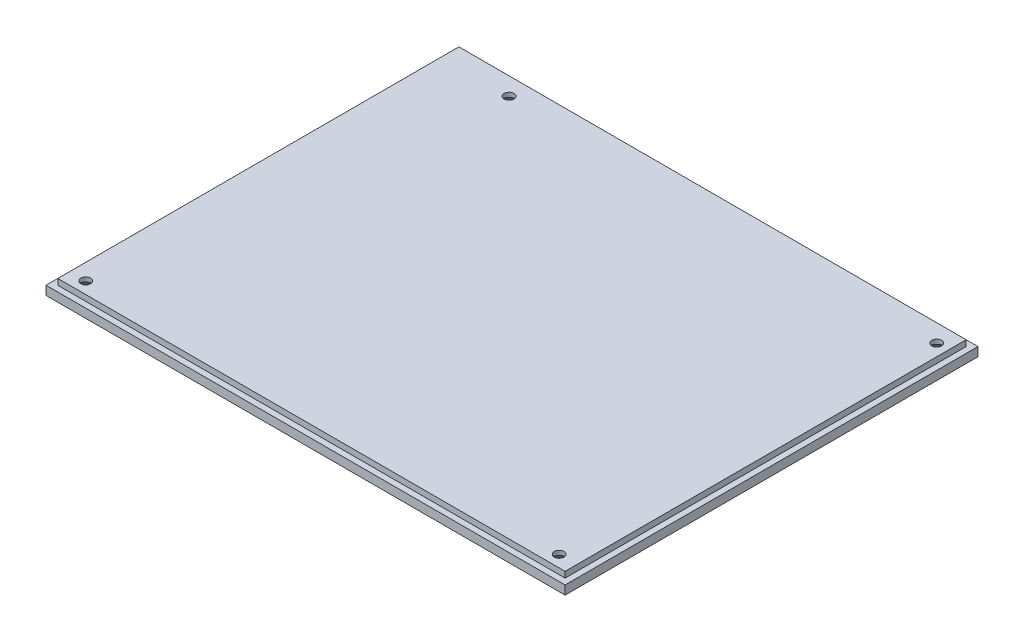
ISO-10303-21;
HEADER;
FILE_DESCRIPTION(('STEP AP214'),'2;1');
FILE_NAME('part.step','',(''),(''),'','','');
FILE_SCHEMA(('AUTOMOTIVE_DESIGN { 1 0 10303 214 1 1 1 1 }'));
ENDSEC;
DATA;
#1=APPLICATION_CONTEXT('core data for automotive mechanical design processes');
#2=APPLICATION_PROTOCOL_DEFINITION('international standard','automotive_design',2000,#1);
#3=PRODUCT_CONTEXT('',#1,'mechanical');
#4=PRODUCT('Part','Part','',(#3));
#5=PRODUCT_RELATED_PRODUCT_CATEGORY('part','',(#4));
#6=PRODUCT_DEFINITION_FORMATION('','',#4);
#7=PRODUCT_DEFINITION_CONTEXT('part definition',#1,'design');
#8=PRODUCT_DEFINITION('design','',#6,#7);
#9=PRODUCT_DEFINITION_SHAPE('','',#8);
#10=(LENGTH_UNIT() NAMED_UNIT(*) SI_UNIT(.MILLI.,.METRE.));
#11=(NAMED_UNIT(*) PLANE_ANGLE_UNIT() SI_UNIT($,.RADIAN.));
#12=(NAMED_UNIT(*) SI_UNIT($,.STERADIAN.) SOLID_ANGLE_UNIT());
#13=UNCERTAINTY_MEASURE_WITH_UNIT(LENGTH_MEASURE(1.E-05),#10,'distance_accuracy_value','');
#14=(GEOMETRIC_REPRESENTATION_CONTEXT(3) GLOBAL_UNCERTAINTY_ASSIGNED_CONTEXT((#13)) GLOBAL_UNIT_ASSIGNED_CONTEXT((#10,
#11,#12)) REPRESENTATION_CONTEXT('',''));
#15=CARTESIAN_POINT('',(0.,0.,0.));
#16=DIRECTION('',(0.,0.,1.));
#17=DIRECTION('',(1.,0.,0.));
#18=AXIS2_PLACEMENT_3D('',#15,#16,#17);
#19=CARTESIAN_POINT('',(0.,1.5,0.));
#20=DIRECTION('',(0.,-1.,0.));
#21=DIRECTION('',(0.,0.,-1.));
#22=AXIS2_PLACEMENT_3D('',#19,#20,#21);
#23=PLANE('',#22);
#24=DIRECTION('',(-1.,0.,0.));
#25=VECTOR('',#24,1.);
#26=CARTESIAN_POINT('',(44.,1.5,35.));
#27=LINE('',#26,#25);
#28=CARTESIAN_POINT('',(44.,1.5,35.));
#29=VERTEX_POINT('',#28);
#30=CARTESIAN_POINT('',(-44.,1.5,35.));
#31=VERTEX_POINT('',#30);
#32=EDGE_CURVE('E143',#29,#31,#27,.T.);
#33=ORIENTED_EDGE('',*,*,#32,.F.);
#34=DIRECTION('',(0.,0.,-1.));
#35=VECTOR('',#34,1.);
#36=CARTESIAN_POINT('',(44.,1.5,35.));
#37=LINE('',#36,#35);
#38=CARTESIAN_POINT('',(44.,1.5,-35.));
#39=VERTEX_POINT('',#38);
#40=EDGE_CURVE('E155',#29,#39,#37,.T.);
#41=ORIENTED_EDGE('',*,*,#40,.T.);
#42=DIRECTION('',(-1.,0.,0.));
#43=VECTOR('',#42,1.);
#44=CARTESIAN_POINT('',(44.,1.5,-35.));
#45=LINE('',#44,#43);
#46=CARTESIAN_POINT('',(-44.,1.5,-35.));
#47=VERTEX_POINT('',#46);
#48=EDGE_CURVE('E152',#39,#47,#45,.T.);
#49=ORIENTED_EDGE('',*,*,#48,.T.);
#50=DIRECTION('',(0.,0.,-1.));
#51=VECTOR('',#50,1.);
#52=CARTESIAN_POINT('',(-44.,1.5,35.));
#53=LINE('',#52,#51);
#54=EDGE_CURVE('E147',#31,#47,#53,.T.);
#55=ORIENTED_EDGE('',*,*,#54,.F.);
#56=EDGE_LOOP('',(#33,#41,#49,#55));
#57=FACE_BOUND('',#56,.T.);
#58=DIRECTION('',(0.,0.,1.));
#59=VECTOR('',#58,1.);
#60=CARTESIAN_POINT('',(-43.,1.5,34.));
#61=LINE('',#60,#59);
#62=CARTESIAN_POINT('',(-43.,1.5,-34.));
#63=VERTEX_POINT('',#62);
#64=CARTESIAN_POINT('',(-43.,1.5,34.));
#65=VERTEX_POINT('',#64);
#66=EDGE_CURVE('E60',#63,#65,#61,.T.);
#67=ORIENTED_EDGE('',*,*,#66,.F.);
#68=DIRECTION('',(-1.,0.,0.));
#69=VECTOR('',#68,1.);
#70=CARTESIAN_POINT('',(43.,1.5,-34.));
#71=LINE('',#70,#69);
#72=CARTESIAN_POINT('',(43.,1.5,-34.));
#73=VERTEX_POINT('',#72);
#74=EDGE_CURVE('E64',#73,#63,#71,.T.);
#75=ORIENTED_EDGE('',*,*,#74,.F.);
#76=DIRECTION('',(0.,0.,-1.));
#77=VECTOR('',#76,1.);
#78=CARTESIAN_POINT('',(43.,1.5,34.));
#79=LINE('',#78,#77);
#80=CARTESIAN_POINT('',(43.,1.5,34.));
#81=VERTEX_POINT('',#80);
#82=EDGE_CURVE('E235',#81,#73,#79,.T.);
#83=ORIENTED_EDGE('',*,*,#82,.F.);
#84=DIRECTION('',(1.,0.,0.));
#85=VECTOR('',#84,1.);
#86=CARTESIAN_POINT('',(43.,1.5,34.));
#87=LINE('',#86,#85);
#88=EDGE_CURVE('E232',#65,#81,#87,.T.);
#89=ORIENTED_EDGE('',*,*,#88,.F.);
#90=EDGE_LOOP('',(#67,#75,#83,#89));
#91=FACE_BOUND('',#90,.T.);
#92=ADVANCED_FACE('F42',(#57,#91),#23,.F.);
#93=CARTESIAN_POINT('',(44.,1.5,35.));
#94=DIRECTION('',(0.,0.,1.));
#95=DIRECTION('',(1.,0.,0.));
#96=AXIS2_PLACEMENT_3D('',#93,#94,#95);
#97=PLANE('',#96);
#98=DIRECTION('',(-1.,0.,0.));
#99=VECTOR('',#98,1.);
#100=CARTESIAN_POINT('',(44.,0.,35.));
#101=LINE('',#100,#99);
#102=CARTESIAN_POINT('',(44.,0.,35.));
#103=VERTEX_POINT('',#102);
#104=CARTESIAN_POINT('',(-44.,0.,35.));
#105=VERTEX_POINT('',#104);
#106=EDGE_CURVE('E132',#103,#105,#101,.T.);
#107=ORIENTED_EDGE('',*,*,#106,.F.);
#108=DIRECTION('',(0.,-1.,0.));
#109=VECTOR('',#108,1.);
#110=CARTESIAN_POINT('',(44.,1.5,35.));
#111=LINE('',#110,#109);
#112=EDGE_CURVE('E11',#29,#103,#111,.T.);
#113=ORIENTED_EDGE('',*,*,#112,.F.);
#114=ORIENTED_EDGE('',*,*,#32,.T.);
#115=DIRECTION('',(0.,-1.,0.));
#116=VECTOR('',#115,1.);
#117=CARTESIAN_POINT('',(-44.,1.5,35.));
#118=LINE('',#117,#116);
#119=EDGE_CURVE('E157',#31,#105,#118,.T.);
#120=ORIENTED_EDGE('',*,*,#119,.T.);
#121=EDGE_LOOP('',(#107,#113,#114,#120));
#122=FACE_BOUND('',#121,.T.);
#123=ADVANCED_FACE('F44',(#122),#97,.T.);
#124=CARTESIAN_POINT('',(44.,1.5,35.));
#125=DIRECTION('',(-1.,0.,0.));
#126=DIRECTION('',(0.,0.,1.));
#127=AXIS2_PLACEMENT_3D('',#124,#125,#126);
#128=PLANE('',#127);
#129=DIRECTION('',(0.,0.,-1.));
#130=VECTOR('',#129,1.);
#131=CARTESIAN_POINT('',(44.,0.,35.));
#132=LINE('',#131,#130);
#133=CARTESIAN_POINT('',(44.,0.,-35.));
#134=VERTEX_POINT('',#133);
#135=EDGE_CURVE('E148',#103,#134,#132,.T.);
#136=ORIENTED_EDGE('',*,*,#135,.T.);
#137=DIRECTION('',(0.,-1.,0.));
#138=VECTOR('',#137,1.);
#139=CARTESIAN_POINT('',(44.,1.5,-35.));
#140=LINE('',#139,#138);
#141=EDGE_CURVE('E52',#39,#134,#140,.T.);
#142=ORIENTED_EDGE('',*,*,#141,.F.);
#143=ORIENTED_EDGE('',*,*,#40,.F.);
#144=ORIENTED_EDGE('',*,*,#112,.T.);
#145=EDGE_LOOP('',(#136,#142,#143,#144));
#146=FACE_BOUND('',#145,.T.);
#147=ADVANCED_FACE('F254',(#146),#128,.F.);
#148=CARTESIAN_POINT('',(44.,1.5,-35.));
#149=DIRECTION('',(0.,0.,1.));
#150=DIRECTION('',(1.,0.,0.));
#151=AXIS2_PLACEMENT_3D('',#148,#149,#150);
#152=PLANE('',#151);
#153=DIRECTION('',(-1.,0.,0.));
#154=VECTOR('',#153,1.);
#155=CARTESIAN_POINT('',(44.,0.,-35.));
#156=LINE('',#155,#154);
#157=CARTESIAN_POINT('',(-44.,0.,-35.));
#158=VERTEX_POINT('',#157);
#159=EDGE_CURVE('E162',#134,#158,#156,.T.);
#160=ORIENTED_EDGE('',*,*,#159,.T.);
#161=DIRECTION('',(0.,-1.,0.));
#162=VECTOR('',#161,1.);
#163=CARTESIAN_POINT('',(-44.,1.5,-35.));
#164=LINE('',#163,#162);
#165=EDGE_CURVE('E171',#47,#158,#164,.T.);
#166=ORIENTED_EDGE('',*,*,#165,.F.);
#167=ORIENTED_EDGE('',*,*,#48,.F.);
#168=ORIENTED_EDGE('',*,*,#141,.T.);
#169=EDGE_LOOP('',(#160,#166,#167,#168));
#170=FACE_BOUND('',#169,.T.);
#171=ADVANCED_FACE('F267',(#170),#152,.F.);
#172=CARTESIAN_POINT('',(-44.,1.5,35.));
#173=DIRECTION('',(-1.,0.,0.));
#174=DIRECTION('',(0.,0.,1.));
#175=AXIS2_PLACEMENT_3D('',#172,#173,#174);
#176=PLANE('',#175);
#177=DIRECTION('',(0.,0.,-1.));
#178=VECTOR('',#177,1.);
#179=CARTESIAN_POINT('',(-44.,0.,35.));
#180=LINE('',#179,#178);
#181=EDGE_CURVE('E137',#105,#158,#180,.T.);
#182=ORIENTED_EDGE('',*,*,#181,.F.);
#183=ORIENTED_EDGE('',*,*,#119,.F.);
#184=ORIENTED_EDGE('',*,*,#54,.T.);
#185=ORIENTED_EDGE('',*,*,#165,.T.);
#186=EDGE_LOOP('',(#182,#183,#184,#185));
#187=FACE_BOUND('',#186,.T.);
#188=ADVANCED_FACE('F263',(#187),#176,.T.);
#189=CARTESIAN_POINT('',(0.,0.,0.));
#190=DIRECTION('',(0.,-1.,0.));
#191=DIRECTION('',(0.,0.,-1.));
#192=AXIS2_PLACEMENT_3D('',#189,#190,#191);
#193=PLANE('',#192);
#194=CARTESIAN_POINT('',(40.,0.,32.));
#195=DIRECTION('',(0.,-1.,0.));
#196=DIRECTION('',(0.,0.,-1.));
#197=AXIS2_PLACEMENT_3D('',#194,#195,#196);
#198=CIRCLE('',#197,2.75);
#199=CARTESIAN_POINT('',(40.,0.,29.25));
#200=VERTEX_POINT('',#199);
#201=EDGE_CURVE('E527',#200,#200,#198,.T.);
#202=ORIENTED_EDGE('',*,*,#201,.F.);
#203=EDGE_LOOP('',(#202));
#204=FACE_BOUND('',#203,.T.);
#205=CARTESIAN_POINT('',(41.,0.,-31.));
#206=DIRECTION('',(0.,-1.,0.));
#207=DIRECTION('',(0.,0.,-1.));
#208=AXIS2_PLACEMENT_3D('',#205,#206,#207);
#209=CIRCLE('',#208,2.75);
#210=CARTESIAN_POINT('',(41.,0.,-33.75));
#211=VERTEX_POINT('',#210);
#212=EDGE_CURVE('E205',#211,#211,#209,.T.);
#213=ORIENTED_EDGE('',*,*,#212,.F.);
#214=EDGE_LOOP('',(#213));
#215=FACE_BOUND('',#214,.T.);
#216=CARTESIAN_POINT('',(-31.5,0.,-31.));
#217=DIRECTION('',(0.,-1.,0.));
#218=DIRECTION('',(0.,0.,-1.));
#219=AXIS2_PLACEMENT_3D('',#216,#217,#218);
#220=CIRCLE('',#219,2.75);
#221=CARTESIAN_POINT('',(-31.5,0.,-33.75));
#222=VERTEX_POINT('',#221);
#223=EDGE_CURVE('E189',#222,#222,#220,.T.);
#224=ORIENTED_EDGE('',*,*,#223,.F.);
#225=EDGE_LOOP('',(#224));
#226=FACE_BOUND('',#225,.T.);
#227=CARTESIAN_POINT('',(-40.268,0.,32.));
#228=DIRECTION('',(0.,-1.,0.));
#229=DIRECTION('',(0.,0.,-1.));
#230=AXIS2_PLACEMENT_3D('',#227,#228,#229);
#231=CIRCLE('',#230,2.75);
#232=CARTESIAN_POINT('',(-40.268,0.,29.25));
#233=VERTEX_POINT('',#232);
#234=EDGE_CURVE('E184',#233,#233,#231,.T.);
#235=ORIENTED_EDGE('',*,*,#234,.F.);
#236=EDGE_LOOP('',(#235));
#237=FACE_BOUND('',#236,.T.);
#238=ORIENTED_EDGE('',*,*,#106,.T.);
#239=ORIENTED_EDGE('',*,*,#181,.T.);
#240=ORIENTED_EDGE('',*,*,#159,.F.);
#241=ORIENTED_EDGE('',*,*,#135,.F.);
#242=EDGE_LOOP('',(#238,#239,#240,#241));
#243=FACE_BOUND('',#242,.T.);
#244=ADVANCED_FACE('F260',(#204,#215,#226,#237,#243),#193,.T.);
#245=CARTESIAN_POINT('',(-43.,2.5,34.));
#246=DIRECTION('',(1.,0.,0.));
#247=DIRECTION('',(0.,0.,-1.));
#248=AXIS2_PLACEMENT_3D('',#245,#246,#247);
#249=PLANE('',#248);
#250=ORIENTED_EDGE('',*,*,#66,.T.);
#251=DIRECTION('',(0.,-1.,0.));
#252=VECTOR('',#251,1.);
#253=CARTESIAN_POINT('',(-43.,2.5,34.));
#254=LINE('',#253,#252);
#255=CARTESIAN_POINT('',(-43.,2.5,34.));
#256=VERTEX_POINT('',#255);
#257=EDGE_CURVE('E112',#256,#65,#254,.T.);
#258=ORIENTED_EDGE('',*,*,#257,.F.);
#259=DIRECTION('',(0.,0.,1.));
#260=VECTOR('',#259,1.);
#261=CARTESIAN_POINT('',(-43.,2.5,34.));
#262=LINE('',#261,#260);
#263=CARTESIAN_POINT('',(-43.,2.5,-34.));
#264=VERTEX_POINT('',#263);
#265=EDGE_CURVE('E119',#264,#256,#262,.T.);
#266=ORIENTED_EDGE('',*,*,#265,.F.);
#267=DIRECTION('',(0.,-1.,0.));
#268=VECTOR('',#267,1.);
#269=CARTESIAN_POINT('',(-43.,2.5,-34.));
#270=LINE('',#269,#268);
#271=EDGE_CURVE('E229',#264,#63,#270,.T.);
#272=ORIENTED_EDGE('',*,*,#271,.T.);
#273=EDGE_LOOP('',(#250,#258,#266,#272));
#274=FACE_BOUND('',#273,.T.);
#275=ADVANCED_FACE('F130',(#274),#249,.F.);
#276=CARTESIAN_POINT('',(43.,2.5,34.));
#277=DIRECTION('',(0.,0.,-1.));
#278=DIRECTION('',(-1.,0.,0.));
#279=AXIS2_PLACEMENT_3D('',#276,#277,#278);
#280=PLANE('',#279);
#281=ORIENTED_EDGE('',*,*,#88,.T.);
#282=DIRECTION('',(0.,-1.,0.));
#283=VECTOR('',#282,1.);
#284=CARTESIAN_POINT('',(43.,2.5,34.));
#285=LINE('',#284,#283);
#286=CARTESIAN_POINT('',(43.,2.5,34.));
#287=VERTEX_POINT('',#286);
#288=EDGE_CURVE('E114',#287,#81,#285,.T.);
#289=ORIENTED_EDGE('',*,*,#288,.F.);
#290=DIRECTION('',(1.,0.,0.));
#291=VECTOR('',#290,1.);
#292=CARTESIAN_POINT('',(43.,2.5,34.));
#293=LINE('',#292,#291);
#294=EDGE_CURVE('E107',#256,#287,#293,.T.);
#295=ORIENTED_EDGE('',*,*,#294,.F.);
#296=ORIENTED_EDGE('',*,*,#257,.T.);
#297=EDGE_LOOP('',(#281,#289,#295,#296));
#298=FACE_BOUND('',#297,.T.);
#299=ADVANCED_FACE('F110',(#298),#280,.F.);
#300=CARTESIAN_POINT('',(43.,2.5,34.));
#301=DIRECTION('',(-1.,0.,0.));
#302=DIRECTION('',(0.,0.,1.));
#303=AXIS2_PLACEMENT_3D('',#300,#301,#302);
#304=PLANE('',#303);
#305=ORIENTED_EDGE('',*,*,#82,.T.);
#306=DIRECTION('',(0.,-1.,0.));
#307=VECTOR('',#306,1.);
#308=CARTESIAN_POINT('',(43.,2.5,-34.));
#309=LINE('',#308,#307);
#310=CARTESIAN_POINT('',(43.,2.5,-34.));
#311=VERTEX_POINT('',#310);
#312=EDGE_CURVE('E139',#311,#73,#309,.T.);
#313=ORIENTED_EDGE('',*,*,#312,.F.);
#314=DIRECTION('',(0.,0.,-1.));
#315=VECTOR('',#314,1.);
#316=CARTESIAN_POINT('',(43.,2.5,34.));
#317=LINE('',#316,#315);
#318=EDGE_CURVE('E118',#287,#311,#317,.T.);
#319=ORIENTED_EDGE('',*,*,#318,.F.);
#320=ORIENTED_EDGE('',*,*,#288,.T.);
#321=EDGE_LOOP('',(#305,#313,#319,#320));
#322=FACE_BOUND('',#321,.T.);
#323=ADVANCED_FACE('F247',(#322),#304,.F.);
#324=CARTESIAN_POINT('',(43.,2.5,-34.));
#325=DIRECTION('',(0.,0.,1.));
#326=DIRECTION('',(1.,0.,0.));
#327=AXIS2_PLACEMENT_3D('',#324,#325,#326);
#328=PLANE('',#327);
#329=ORIENTED_EDGE('',*,*,#74,.T.);
#330=ORIENTED_EDGE('',*,*,#271,.F.);
#331=DIRECTION('',(-1.,0.,0.));
#332=VECTOR('',#331,1.);
#333=CARTESIAN_POINT('',(43.,2.5,-34.));
#334=LINE('',#333,#332);
#335=EDGE_CURVE('E124',#311,#264,#334,.T.);
#336=ORIENTED_EDGE('',*,*,#335,.F.);
#337=ORIENTED_EDGE('',*,*,#312,.T.);
#338=EDGE_LOOP('',(#329,#330,#336,#337));
#339=FACE_BOUND('',#338,.T.);
#340=ADVANCED_FACE('F245',(#339),#328,.F.);
#341=CARTESIAN_POINT('',(0.,2.5,0.));
#342=DIRECTION('',(0.,1.,0.));
#343=DIRECTION('',(0.,0.,1.));
#344=AXIS2_PLACEMENT_3D('',#341,#342,#343);
#345=PLANE('',#344);
#346=CARTESIAN_POINT('',(40.,2.5,32.));
#347=DIRECTION('',(0.,1.,0.));
#348=DIRECTION('',(0.,0.,1.));
#349=AXIS2_PLACEMENT_3D('',#346,#347,#348);
#350=CIRCLE('',#349,0.832139741175258);
#351=CARTESIAN_POINT('',(40.,2.5,32.8321397411752));
#352=VERTEX_POINT('',#351);
#353=EDGE_CURVE('E46',#352,#352,#350,.T.);
#354=ORIENTED_EDGE('',*,*,#353,.F.);
#355=EDGE_LOOP('',(#354));
#356=FACE_BOUND('',#355,.T.);
#357=CARTESIAN_POINT('',(41.,2.5,-31.));
#358=DIRECTION('',(0.,1.,0.));
#359=DIRECTION('',(0.,0.,1.));
#360=AXIS2_PLACEMENT_3D('',#357,#358,#359);
#361=CIRCLE('',#360,0.832139741175258);
#362=CARTESIAN_POINT('',(41.,2.5,-30.1678602588248));
#363=VERTEX_POINT('',#362);
#364=EDGE_CURVE('E186',#363,#363,#361,.T.);
#365=ORIENTED_EDGE('',*,*,#364,.F.);
#366=EDGE_LOOP('',(#365));
#367=FACE_BOUND('',#366,.T.);
#368=CARTESIAN_POINT('',(-31.5,2.5,-31.));
#369=DIRECTION('',(0.,1.,0.));
#370=DIRECTION('',(0.,0.,1.));
#371=AXIS2_PLACEMENT_3D('',#368,#369,#370);
#372=CIRCLE('',#371,0.832139741175258);
#373=CARTESIAN_POINT('',(-31.5,2.5,-30.1678602588247));
#374=VERTEX_POINT('',#373);
#375=EDGE_CURVE('E181',#374,#374,#372,.T.);
#376=ORIENTED_EDGE('',*,*,#375,.F.);
#377=EDGE_LOOP('',(#376));
#378=FACE_BOUND('',#377,.T.);
#379=CARTESIAN_POINT('',(-40.268,2.5,32.));
#380=DIRECTION('',(0.,1.,0.));
#381=DIRECTION('',(0.,0.,1.));
#382=AXIS2_PLACEMENT_3D('',#379,#380,#381);
#383=CIRCLE('',#382,0.832139741175258);
#384=CARTESIAN_POINT('',(-40.268,2.5,32.8321397411752));
#385=VERTEX_POINT('',#384);
#386=EDGE_CURVE('E176',#385,#385,#383,.T.);
#387=ORIENTED_EDGE('',*,*,#386,.F.);
#388=EDGE_LOOP('',(#387));
#389=FACE_BOUND('',#388,.T.);
#390=ORIENTED_EDGE('',*,*,#265,.T.);
#391=ORIENTED_EDGE('',*,*,#294,.T.);
#392=ORIENTED_EDGE('',*,*,#318,.T.);
#393=ORIENTED_EDGE('',*,*,#335,.T.);
#394=EDGE_LOOP('',(#390,#391,#392,#393));
#395=FACE_BOUND('',#394,.T.);
#396=ADVANCED_FACE('F122',(#356,#367,#378,#389,#395),#345,.T.);
#397=CARTESIAN_POINT('',(-40.268,2.12875210241004,32.));
#398=DIRECTION('',(0.,-1.,0.));
#399=DIRECTION('',(0.,0.,-1.));
#400=AXIS2_PLACEMENT_3D('',#397,#398,#399);
#401=CONICAL_SURFACE('',#400,1.45,1.02974425867665);
#402=ORIENTED_EDGE('',*,*,#386,.T.);
#403=EDGE_LOOP('',(#402));
#404=FACE_BOUND('',#403,.T.);
#405=CARTESIAN_POINT('',(-40.268,2.12875210241004,32.));
#406=DIRECTION('',(0.,-1.,0.));
#407=DIRECTION('',(0.,0.,-1.));
#408=AXIS2_PLACEMENT_3D('',#405,#406,#407);
#409=CIRCLE('',#408,1.45);
#410=CARTESIAN_POINT('',(-40.268,2.12875210241004,30.55));
#411=VERTEX_POINT('',#410);
#412=EDGE_CURVE('E180',#411,#411,#409,.T.);
#413=ORIENTED_EDGE('',*,*,#412,.T.);
#414=EDGE_LOOP('',(#413));
#415=FACE_BOUND('',#414,.T.);
#416=ADVANCED_FACE('F324',(#404,#415),#401,.F.);
#417=CARTESIAN_POINT('',(-40.268,0.,32.));
#418=DIRECTION('',(0.,-1.,0.));
#419=DIRECTION('',(0.,0.,-1.));
#420=AXIS2_PLACEMENT_3D('',#417,#418,#419);
#421=CYLINDRICAL_SURFACE('',#420,1.45);
#422=ORIENTED_EDGE('',*,*,#412,.F.);
#423=EDGE_LOOP('',(#422));
#424=FACE_BOUND('',#423,.T.);
#425=CARTESIAN_POINT('',(-40.268,1.3,32.));
#426=DIRECTION('',(0.,-1.,0.));
#427=DIRECTION('',(0.,0.,-1.));
#428=AXIS2_PLACEMENT_3D('',#425,#426,#427);
#429=CIRCLE('',#428,1.45);
#430=CARTESIAN_POINT('',(-40.268,1.3,30.55));
#431=VERTEX_POINT('',#430);
#432=EDGE_CURVE('E218',#431,#431,#429,.T.);
#433=ORIENTED_EDGE('',*,*,#432,.T.);
#434=EDGE_LOOP('',(#433));
#435=FACE_BOUND('',#434,.T.);
#436=ADVANCED_FACE('F335',(#424,#435),#421,.F.);
#437=CARTESIAN_POINT('',(-40.268,0.,32.));
#438=DIRECTION('',(0.,-1.,0.));
#439=DIRECTION('',(0.,0.,-1.));
#440=AXIS2_PLACEMENT_3D('',#437,#438,#439);
#441=CONICAL_SURFACE('',#440,2.75,0.785398163397446);
#442=ORIENTED_EDGE('',*,*,#432,.F.);
#443=EDGE_LOOP('',(#442));
#444=FACE_BOUND('',#443,.T.);
#445=ORIENTED_EDGE('',*,*,#234,.T.);
#446=EDGE_LOOP('',(#445));
#447=FACE_BOUND('',#446,.T.);
#448=ADVANCED_FACE('F342',(#444,#447),#441,.F.);
#449=CARTESIAN_POINT('',(-31.5,2.12875210241004,-31.));
#450=DIRECTION('',(0.,-1.,0.));
#451=DIRECTION('',(0.,0.,-1.));
#452=AXIS2_PLACEMENT_3D('',#449,#450,#451);
#453=CONICAL_SURFACE('',#452,1.45,1.02974425867665);
#454=ORIENTED_EDGE('',*,*,#375,.T.);
#455=EDGE_LOOP('',(#454));
#456=FACE_BOUND('',#455,.T.);
#457=CARTESIAN_POINT('',(-31.5,2.12875210241004,-31.));
#458=DIRECTION('',(0.,-1.,0.));
#459=DIRECTION('',(0.,0.,-1.));
#460=AXIS2_PLACEMENT_3D('',#457,#458,#459);
#461=CIRCLE('',#460,1.45);
#462=CARTESIAN_POINT('',(-31.5,2.12875210241004,-32.45));
#463=VERTEX_POINT('',#462);
#464=EDGE_CURVE('E185',#463,#463,#461,.T.);
#465=ORIENTED_EDGE('',*,*,#464,.T.);
#466=EDGE_LOOP('',(#465));
#467=FACE_BOUND('',#466,.T.);
#468=ADVANCED_FACE('F350',(#456,#467),#453,.F.);
#469=CARTESIAN_POINT('',(-31.5,0.,-31.));
#470=DIRECTION('',(0.,-1.,0.));
#471=DIRECTION('',(0.,0.,-1.));
#472=AXIS2_PLACEMENT_3D('',#469,#470,#471);
#473=CYLINDRICAL_SURFACE('',#472,1.45);
#474=ORIENTED_EDGE('',*,*,#464,.F.);
#475=EDGE_LOOP('',(#474));
#476=FACE_BOUND('',#475,.T.);
#477=CARTESIAN_POINT('',(-31.5,1.3,-31.));
#478=DIRECTION('',(0.,-1.,0.));
#479=DIRECTION('',(0.,0.,-1.));
#480=AXIS2_PLACEMENT_3D('',#477,#478,#479);
#481=CIRCLE('',#480,1.45);
#482=CARTESIAN_POINT('',(-31.5,1.3,-32.45));
#483=VERTEX_POINT('',#482);
#484=EDGE_CURVE('E196',#483,#483,#481,.T.);
#485=ORIENTED_EDGE('',*,*,#484,.T.);
#486=EDGE_LOOP('',(#485));
#487=FACE_BOUND('',#486,.T.);
#488=ADVANCED_FACE('F358',(#476,#487),#473,.F.);
#489=CARTESIAN_POINT('',(-31.5,0.,-31.));
#490=DIRECTION('',(0.,-1.,0.));
#491=DIRECTION('',(0.,0.,-1.));
#492=AXIS2_PLACEMENT_3D('',#489,#490,#491);
#493=CONICAL_SURFACE('',#492,2.75,0.785398163397447);
#494=ORIENTED_EDGE('',*,*,#484,.F.);
#495=EDGE_LOOP('',(#494));
#496=FACE_BOUND('',#495,.T.);
#497=ORIENTED_EDGE('',*,*,#223,.T.);
#498=EDGE_LOOP('',(#497));
#499=FACE_BOUND('',#498,.T.);
#500=ADVANCED_FACE('F366',(#496,#499),#493,.F.);
#501=CARTESIAN_POINT('',(41.,2.12875210241004,-31.));
#502=DIRECTION('',(0.,-1.,0.));
#503=DIRECTION('',(0.,0.,-1.));
#504=AXIS2_PLACEMENT_3D('',#501,#502,#503);
#505=CONICAL_SURFACE('',#504,1.45,1.02974425867665);
#506=ORIENTED_EDGE('',*,*,#364,.T.);
#507=EDGE_LOOP('',(#506));
#508=FACE_BOUND('',#507,.T.);
#509=CARTESIAN_POINT('',(41.,2.12875210241004,-31.));
#510=DIRECTION('',(0.,-1.,0.));
#511=DIRECTION('',(0.,0.,-1.));
#512=AXIS2_PLACEMENT_3D('',#509,#510,#511);
#513=CIRCLE('',#512,1.45);
#514=CARTESIAN_POINT('',(41.,2.12875210241004,-32.45));
#515=VERTEX_POINT('',#514);
#516=EDGE_CURVE('E190',#515,#515,#513,.T.);
#517=ORIENTED_EDGE('',*,*,#516,.T.);
#518=EDGE_LOOP('',(#517));
#519=FACE_BOUND('',#518,.T.);
#520=ADVANCED_FACE('F374',(#508,#519),#505,.F.);
#521=CARTESIAN_POINT('',(41.,0.,-31.));
#522=DIRECTION('',(0.,-1.,0.));
#523=DIRECTION('',(0.,0.,-1.));
#524=AXIS2_PLACEMENT_3D('',#521,#522,#523);
#525=CYLINDRICAL_SURFACE('',#524,1.45);
#526=ORIENTED_EDGE('',*,*,#516,.F.);
#527=EDGE_LOOP('',(#526));
#528=FACE_BOUND('',#527,.T.);
#529=CARTESIAN_POINT('',(41.,1.3,-31.));
#530=DIRECTION('',(0.,-1.,0.));
#531=DIRECTION('',(0.,0.,-1.));
#532=AXIS2_PLACEMENT_3D('',#529,#530,#531);
#533=CIRCLE('',#532,1.45);
#534=CARTESIAN_POINT('',(41.,1.3,-32.45));
#535=VERTEX_POINT('',#534);
#536=EDGE_CURVE('E199',#535,#535,#533,.T.);
#537=ORIENTED_EDGE('',*,*,#536,.T.);
#538=EDGE_LOOP('',(#537));
#539=FACE_BOUND('',#538,.T.);
#540=ADVANCED_FACE('F382',(#528,#539),#525,.F.);
#541=CARTESIAN_POINT('',(41.,0.,-31.));
#542=DIRECTION('',(0.,-1.,0.));
#543=DIRECTION('',(0.,0.,-1.));
#544=AXIS2_PLACEMENT_3D('',#541,#542,#543);
#545=CONICAL_SURFACE('',#544,2.75,0.785398163397446);
#546=ORIENTED_EDGE('',*,*,#536,.F.);
#547=EDGE_LOOP('',(#546));
#548=FACE_BOUND('',#547,.T.);
#549=ORIENTED_EDGE('',*,*,#212,.T.);
#550=EDGE_LOOP('',(#549));
#551=FACE_BOUND('',#550,.T.);
#552=ADVANCED_FACE('F389',(#548,#551),#545,.F.);
#553=CARTESIAN_POINT('',(40.,2.12875210241004,32.));
#554=DIRECTION('',(0.,-1.,0.));
#555=DIRECTION('',(0.,0.,-1.));
#556=AXIS2_PLACEMENT_3D('',#553,#554,#555);
#557=CONICAL_SURFACE('',#556,1.45,1.02974425867665);
#558=ORIENTED_EDGE('',*,*,#353,.T.);
#559=EDGE_LOOP('',(#558));
#560=FACE_BOUND('',#559,.T.);
#561=CARTESIAN_POINT('',(40.,2.12875210241004,32.));
#562=DIRECTION('',(0.,-1.,0.));
#563=DIRECTION('',(0.,0.,-1.));
#564=AXIS2_PLACEMENT_3D('',#561,#562,#563);
#565=CIRCLE('',#564,1.45);
#566=CARTESIAN_POINT('',(40.,2.12875210241004,30.55));
#567=VERTEX_POINT('',#566);
#568=EDGE_CURVE('E531',#567,#567,#565,.T.);
#569=ORIENTED_EDGE('',*,*,#568,.T.);
#570=EDGE_LOOP('',(#569));
#571=FACE_BOUND('',#570,.T.);
#572=ADVANCED_FACE('F397',(#560,#571),#557,.F.);
#573=CARTESIAN_POINT('',(40.,0.,32.));
#574=DIRECTION('',(0.,-1.,0.));
#575=DIRECTION('',(0.,0.,-1.));
#576=AXIS2_PLACEMENT_3D('',#573,#574,#575);
#577=CYLINDRICAL_SURFACE('',#576,1.45);
#578=ORIENTED_EDGE('',*,*,#568,.F.);
#579=EDGE_LOOP('',(#578));
#580=FACE_BOUND('',#579,.T.);
#581=CARTESIAN_POINT('',(40.,1.3,32.));
#582=DIRECTION('',(0.,-1.,0.));
#583=DIRECTION('',(0.,0.,-1.));
#584=AXIS2_PLACEMENT_3D('',#581,#582,#583);
#585=CIRCLE('',#584,1.45);
#586=CARTESIAN_POINT('',(40.,1.3,30.55));
#587=VERTEX_POINT('',#586);
#588=EDGE_CURVE('E524',#587,#587,#585,.T.);
#589=ORIENTED_EDGE('',*,*,#588,.T.);
#590=EDGE_LOOP('',(#589));
#591=FACE_BOUND('',#590,.T.);
#592=ADVANCED_FACE('F405',(#580,#591),#577,.F.);
#593=CARTESIAN_POINT('',(40.,0.,32.));
#594=DIRECTION('',(0.,-1.,0.));
#595=DIRECTION('',(0.,0.,-1.));
#596=AXIS2_PLACEMENT_3D('',#593,#594,#595);
#597=CONICAL_SURFACE('',#596,2.75,0.785398163397449);
#598=ORIENTED_EDGE('',*,*,#588,.F.);
#599=EDGE_LOOP('',(#598));
#600=FACE_BOUND('',#599,.T.);
#601=ORIENTED_EDGE('',*,*,#201,.T.);
#602=EDGE_LOOP('',(#601));
#603=FACE_BOUND('',#602,.T.);
#604=ADVANCED_FACE('F413',(#600,#603),#597,.F.);
#605=CLOSED_SHELL('',(#92,#123,#147,#171,#188,#244,#275,#299,#323,#340,#396,#416,#436,#448,#468,
#488,#500,#520,#540,#552,#572,#592,#604));
#606=MANIFOLD_SOLID_BREP('B2',#605);
#607=ADVANCED_BREP_SHAPE_REPRESENTATION('',(#18,#606),#14);
#608=SHAPE_DEFINITION_REPRESENTATION(#9,#607);
ENDSEC;
END-ISO-10303-21;
